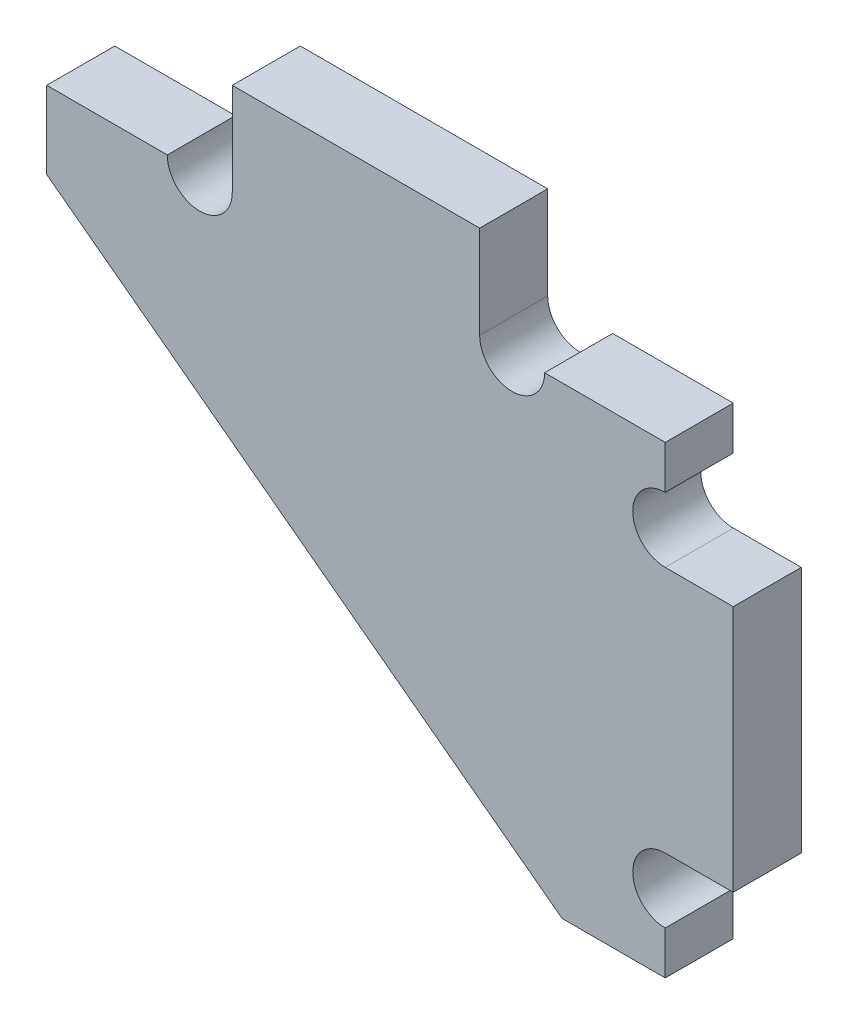
ISO-10303-21;
HEADER;
FILE_DESCRIPTION(('STEP AP214'),'2;1');
FILE_NAME('part.step','',(''),(''),'','','');
FILE_SCHEMA(('AUTOMOTIVE_DESIGN { 1 0 10303 214 1 1 1 1 }'));
ENDSEC;
DATA;
#1=APPLICATION_CONTEXT('core data for automotive mechanical design processes');
#2=APPLICATION_PROTOCOL_DEFINITION('international standard','automotive_design',2000,#1);
#3=PRODUCT_CONTEXT('',#1,'mechanical');
#4=PRODUCT('Part','Part','',(#3));
#5=PRODUCT_RELATED_PRODUCT_CATEGORY('part','',(#4));
#6=PRODUCT_DEFINITION_FORMATION('','',#4);
#7=PRODUCT_DEFINITION_CONTEXT('part definition',#1,'design');
#8=PRODUCT_DEFINITION('design','',#6,#7);
#9=PRODUCT_DEFINITION_SHAPE('','',#8);
#10=(LENGTH_UNIT() NAMED_UNIT(*) SI_UNIT(.MILLI.,.METRE.));
#11=(NAMED_UNIT(*) PLANE_ANGLE_UNIT() SI_UNIT($,.RADIAN.));
#12=(NAMED_UNIT(*) SI_UNIT($,.STERADIAN.) SOLID_ANGLE_UNIT());
#13=UNCERTAINTY_MEASURE_WITH_UNIT(LENGTH_MEASURE(1.E-05),#10,'distance_accuracy_value','');
#14=(GEOMETRIC_REPRESENTATION_CONTEXT(3) GLOBAL_UNCERTAINTY_ASSIGNED_CONTEXT((#13)) GLOBAL_UNIT_ASSIGNED_CONTEXT((#10,
#11,#12)) REPRESENTATION_CONTEXT('',''));
#15=CARTESIAN_POINT('',(0.,0.,0.));
#16=DIRECTION('',(0.,0.,1.));
#17=DIRECTION('',(1.,0.,0.));
#18=AXIS2_PLACEMENT_3D('',#15,#16,#17);
#19=CARTESIAN_POINT('',(5.05,7.5,2.2));
#20=DIRECTION('',(0.,0.,-1.));
#21=DIRECTION('',(-1.,0.,0.));
#22=AXIS2_PLACEMENT_3D('',#19,#20,#21);
#23=CYLINDRICAL_SURFACE('',#22,1.05);
#24=CARTESIAN_POINT('',(5.05,7.5,0.));
#25=DIRECTION('',(0.,0.,1.));
#26=DIRECTION('',(1.,0.,0.));
#27=AXIS2_PLACEMENT_3D('',#24,#25,#26);
#28=CIRCLE('',#27,1.05);
#29=CARTESIAN_POINT('',(4.,7.5,0.));
#30=VERTEX_POINT('',#29);
#31=CARTESIAN_POINT('',(6.1,7.5,0.));
#32=VERTEX_POINT('',#31);
#33=EDGE_CURVE('E184',#30,#32,#28,.T.);
#34=ORIENTED_EDGE('',*,*,#33,.F.);
#35=DIRECTION('',(0.,0.,-1.));
#36=VECTOR('',#35,1.);
#37=CARTESIAN_POINT('',(4.,7.5,2.2));
#38=LINE('',#37,#36);
#39=CARTESIAN_POINT('',(4.,7.5,2.2));
#40=VERTEX_POINT('',#39);
#41=EDGE_CURVE('E11',#40,#30,#38,.T.);
#42=ORIENTED_EDGE('',*,*,#41,.F.);
#43=CARTESIAN_POINT('',(5.05,7.5,2.2));
#44=DIRECTION('',(0.,0.,1.));
#45=DIRECTION('',(1.,0.,0.));
#46=AXIS2_PLACEMENT_3D('',#43,#44,#45);
#47=CIRCLE('',#46,1.05);
#48=CARTESIAN_POINT('',(6.1,7.5,2.2));
#49=VERTEX_POINT('',#48);
#50=EDGE_CURVE('E228',#40,#49,#47,.T.);
#51=ORIENTED_EDGE('',*,*,#50,.T.);
#52=DIRECTION('',(0.,0.,-1.));
#53=VECTOR('',#52,1.);
#54=CARTESIAN_POINT('',(6.1,7.5,2.2));
#55=LINE('',#54,#53);
#56=EDGE_CURVE('E113',#49,#32,#55,.T.);
#57=ORIENTED_EDGE('',*,*,#56,.T.);
#58=EDGE_LOOP('',(#34,#42,#51,#57));
#59=FACE_BOUND('',#58,.T.);
#60=ADVANCED_FACE('F36',(#59),#23,.F.);
#61=CARTESIAN_POINT('',(4.,0.,2.2));
#62=DIRECTION('',(1.,0.,0.));
#63=DIRECTION('',(0.,0.,-1.));
#64=AXIS2_PLACEMENT_3D('',#61,#62,#63);
#65=PLANE('',#64);
#66=DIRECTION('',(0.,-1.,0.));
#67=VECTOR('',#66,1.);
#68=CARTESIAN_POINT('',(4.,0.,0.));
#69=LINE('',#68,#67);
#70=CARTESIAN_POINT('',(4.,10.5,0.));
#71=VERTEX_POINT('',#70);
#72=EDGE_CURVE('E187',#71,#30,#69,.T.);
#73=ORIENTED_EDGE('',*,*,#72,.F.);
#74=DIRECTION('',(0.,0.,-1.));
#75=VECTOR('',#74,1.);
#76=CARTESIAN_POINT('',(4.,10.5,2.2));
#77=LINE('',#76,#75);
#78=CARTESIAN_POINT('',(4.,10.5,2.2));
#79=VERTEX_POINT('',#78);
#80=EDGE_CURVE('E44',#79,#71,#77,.T.);
#81=ORIENTED_EDGE('',*,*,#80,.F.);
#82=DIRECTION('',(0.,-1.,0.));
#83=VECTOR('',#82,1.);
#84=CARTESIAN_POINT('',(4.,0.,2.2));
#85=LINE('',#84,#83);
#86=EDGE_CURVE('E278',#79,#40,#85,.T.);
#87=ORIENTED_EDGE('',*,*,#86,.T.);
#88=ORIENTED_EDGE('',*,*,#41,.T.);
#89=EDGE_LOOP('',(#73,#81,#87,#88));
#90=FACE_BOUND('',#89,.T.);
#91=ADVANCED_FACE('F265',(#90),#65,.T.);
#92=CARTESIAN_POINT('',(0.,10.5,2.2));
#93=DIRECTION('',(0.,1.,0.));
#94=DIRECTION('',(-1.,0.,0.));
#95=AXIS2_PLACEMENT_3D('',#92,#93,#94);
#96=PLANE('',#95);
#97=DIRECTION('',(1.,0.,0.));
#98=VECTOR('',#97,1.);
#99=CARTESIAN_POINT('',(0.,10.5,0.));
#100=LINE('',#99,#98);
#101=CARTESIAN_POINT('',(-4.,10.5,0.));
#102=VERTEX_POINT('',#101);
#103=EDGE_CURVE('E190',#102,#71,#100,.T.);
#104=ORIENTED_EDGE('',*,*,#103,.F.);
#105=DIRECTION('',(0.,0.,-1.));
#106=VECTOR('',#105,1.);
#107=CARTESIAN_POINT('',(-4.,10.5,2.2));
#108=LINE('',#107,#106);
#109=CARTESIAN_POINT('',(-4.,10.5,2.2));
#110=VERTEX_POINT('',#109);
#111=EDGE_CURVE('E254',#110,#102,#108,.T.);
#112=ORIENTED_EDGE('',*,*,#111,.F.);
#113=DIRECTION('',(1.,0.,0.));
#114=VECTOR('',#113,1.);
#115=CARTESIAN_POINT('',(0.,10.5,2.2));
#116=LINE('',#115,#114);
#117=EDGE_CURVE('E261',#110,#79,#116,.T.);
#118=ORIENTED_EDGE('',*,*,#117,.T.);
#119=ORIENTED_EDGE('',*,*,#80,.T.);
#120=EDGE_LOOP('',(#104,#112,#118,#119));
#121=FACE_BOUND('',#120,.T.);
#122=ADVANCED_FACE('F259',(#121),#96,.T.);
#123=CARTESIAN_POINT('',(-3.99999999999998,0.,2.2));
#124=DIRECTION('',(-1.,0.,0.));
#125=DIRECTION('',(0.,-1.,0.));
#126=AXIS2_PLACEMENT_3D('',#123,#124,#125);
#127=PLANE('',#126);
#128=DIRECTION('',(0.,1.,0.));
#129=VECTOR('',#128,1.);
#130=CARTESIAN_POINT('',(-3.99999999999998,0.,0.));
#131=LINE('',#130,#129);
#132=CARTESIAN_POINT('',(-4.,7.49999999999999,0.));
#133=VERTEX_POINT('',#132);
#134=EDGE_CURVE('E193',#133,#102,#131,.T.);
#135=ORIENTED_EDGE('',*,*,#134,.F.);
#136=DIRECTION('',(0.,0.,-1.));
#137=VECTOR('',#136,1.);
#138=CARTESIAN_POINT('',(-4.,7.49999999999999,2.2));
#139=LINE('',#138,#137);
#140=CARTESIAN_POINT('',(-4.,7.49999999999999,2.2));
#141=VERTEX_POINT('',#140);
#142=EDGE_CURVE('E252',#141,#133,#139,.T.);
#143=ORIENTED_EDGE('',*,*,#142,.F.);
#144=DIRECTION('',(0.,1.,0.));
#145=VECTOR('',#144,1.);
#146=CARTESIAN_POINT('',(-3.99999999999998,0.,2.2));
#147=LINE('',#146,#145);
#148=EDGE_CURVE('E275',#141,#110,#147,.T.);
#149=ORIENTED_EDGE('',*,*,#148,.T.);
#150=ORIENTED_EDGE('',*,*,#111,.T.);
#151=EDGE_LOOP('',(#135,#143,#149,#150));
#152=FACE_BOUND('',#151,.T.);
#153=ADVANCED_FACE('F272',(#152),#127,.T.);
#154=CARTESIAN_POINT('',(-5.05,7.49999999999999,2.2));
#155=DIRECTION('',(0.,0.,-1.));
#156=DIRECTION('',(-1.,0.,0.));
#157=AXIS2_PLACEMENT_3D('',#154,#155,#156);
#158=CYLINDRICAL_SURFACE('',#157,1.05);
#159=CARTESIAN_POINT('',(-5.05,7.49999999999999,0.));
#160=DIRECTION('',(0.,0.,1.));
#161=DIRECTION('',(1.,0.,0.));
#162=AXIS2_PLACEMENT_3D('',#159,#160,#161);
#163=CIRCLE('',#162,1.05);
#164=CARTESIAN_POINT('',(-6.1,7.5,0.));
#165=VERTEX_POINT('',#164);
#166=EDGE_CURVE('E196',#165,#133,#163,.T.);
#167=ORIENTED_EDGE('',*,*,#166,.F.);
#168=DIRECTION('',(0.,0.,-1.));
#169=VECTOR('',#168,1.);
#170=CARTESIAN_POINT('',(-6.1,7.5,2.2));
#171=LINE('',#170,#169);
#172=CARTESIAN_POINT('',(-6.1,7.5,2.2));
#173=VERTEX_POINT('',#172);
#174=EDGE_CURVE('E250',#173,#165,#171,.T.);
#175=ORIENTED_EDGE('',*,*,#174,.F.);
#176=CARTESIAN_POINT('',(-5.05,7.49999999999999,2.2));
#177=DIRECTION('',(0.,0.,1.));
#178=DIRECTION('',(1.,0.,0.));
#179=AXIS2_PLACEMENT_3D('',#176,#177,#178);
#180=CIRCLE('',#179,1.05);
#181=EDGE_CURVE('E280',#173,#141,#180,.T.);
#182=ORIENTED_EDGE('',*,*,#181,.T.);
#183=ORIENTED_EDGE('',*,*,#142,.T.);
#184=EDGE_LOOP('',(#167,#175,#182,#183));
#185=FACE_BOUND('',#184,.T.);
#186=ADVANCED_FACE('F326',(#185),#158,.F.);
#187=CARTESIAN_POINT('',(0.,7.49999999999999,2.2));
#188=DIRECTION('',(0.,-1.,0.));
#189=DIRECTION('',(1.,0.,0.));
#190=AXIS2_PLACEMENT_3D('',#187,#188,#189);
#191=PLANE('',#190);
#192=DIRECTION('',(-1.,0.,0.));
#193=VECTOR('',#192,1.);
#194=CARTESIAN_POINT('',(0.,7.49999999999999,0.));
#195=LINE('',#194,#193);
#196=CARTESIAN_POINT('',(-10.,7.5,0.));
#197=VERTEX_POINT('',#196);
#198=EDGE_CURVE('E199',#165,#197,#195,.T.);
#199=ORIENTED_EDGE('',*,*,#198,.T.);
#200=DIRECTION('',(0.,0.,-1.));
#201=VECTOR('',#200,1.);
#202=CARTESIAN_POINT('',(-10.,7.5,2.2));
#203=LINE('',#202,#201);
#204=CARTESIAN_POINT('',(-10.,7.5,2.2));
#205=VERTEX_POINT('',#204);
#206=EDGE_CURVE('E248',#205,#197,#203,.T.);
#207=ORIENTED_EDGE('',*,*,#206,.F.);
#208=DIRECTION('',(-1.,0.,0.));
#209=VECTOR('',#208,1.);
#210=CARTESIAN_POINT('',(0.,7.49999999999999,2.2));
#211=LINE('',#210,#209);
#212=EDGE_CURVE('E286',#173,#205,#211,.T.);
#213=ORIENTED_EDGE('',*,*,#212,.F.);
#214=ORIENTED_EDGE('',*,*,#174,.T.);
#215=EDGE_LOOP('',(#199,#207,#213,#214));
#216=FACE_BOUND('',#215,.T.);
#217=ADVANCED_FACE('F329',(#216),#191,.F.);
#218=CARTESIAN_POINT('',(-10.,0.,2.2));
#219=DIRECTION('',(-1.,0.,0.));
#220=DIRECTION('',(0.,0.,1.));
#221=AXIS2_PLACEMENT_3D('',#218,#219,#220);
#222=PLANE('',#221);
#223=DIRECTION('',(0.,1.,0.));
#224=VECTOR('',#223,1.);
#225=CARTESIAN_POINT('',(-10.,0.,0.));
#226=LINE('',#225,#224);
#227=CARTESIAN_POINT('',(-10.,4.99999999999999,0.));
#228=VERTEX_POINT('',#227);
#229=EDGE_CURVE('E202',#228,#197,#226,.T.);
#230=ORIENTED_EDGE('',*,*,#229,.F.);
#231=DIRECTION('',(0.,0.,-1.));
#232=VECTOR('',#231,1.);
#233=CARTESIAN_POINT('',(-10.,4.99999999999999,2.2));
#234=LINE('',#233,#232);
#235=CARTESIAN_POINT('',(-10.,4.99999999999999,2.2));
#236=VERTEX_POINT('',#235);
#237=EDGE_CURVE('E246',#236,#228,#234,.T.);
#238=ORIENTED_EDGE('',*,*,#237,.F.);
#239=DIRECTION('',(0.,1.,0.));
#240=VECTOR('',#239,1.);
#241=CARTESIAN_POINT('',(-10.,0.,2.2));
#242=LINE('',#241,#240);
#243=EDGE_CURVE('E288',#236,#205,#242,.T.);
#244=ORIENTED_EDGE('',*,*,#243,.T.);
#245=ORIENTED_EDGE('',*,*,#206,.T.);
#246=EDGE_LOOP('',(#230,#238,#244,#245));
#247=FACE_BOUND('',#246,.T.);
#248=ADVANCED_FACE('F333',(#247),#222,.T.);
#249=CARTESIAN_POINT('',(-1.2,-1.6,2.2));
#250=DIRECTION('',(0.6,0.8,0.));
#251=DIRECTION('',(-0.8,0.6,0.));
#252=AXIS2_PLACEMENT_3D('',#249,#250,#251);
#253=PLANE('',#252);
#254=DIRECTION('',(0.8,-0.6,0.));
#255=VECTOR('',#254,1.);
#256=CARTESIAN_POINT('',(-1.2,-1.6,0.));
#257=LINE('',#256,#255);
#258=CARTESIAN_POINT('',(6.66666666666666,-7.5,0.));
#259=VERTEX_POINT('',#258);
#260=EDGE_CURVE('E205',#228,#259,#257,.T.);
#261=ORIENTED_EDGE('',*,*,#260,.T.);
#262=DIRECTION('',(0.,0.,-1.));
#263=VECTOR('',#262,1.);
#264=CARTESIAN_POINT('',(6.66666666666666,-7.5,2.2));
#265=LINE('',#264,#263);
#266=CARTESIAN_POINT('',(6.66666666666666,-7.5,2.2));
#267=VERTEX_POINT('',#266);
#268=EDGE_CURVE('E243',#267,#259,#265,.T.);
#269=ORIENTED_EDGE('',*,*,#268,.F.);
#270=DIRECTION('',(0.8,-0.6,0.));
#271=VECTOR('',#270,1.);
#272=CARTESIAN_POINT('',(-1.2,-1.6,2.2));
#273=LINE('',#272,#271);
#274=EDGE_CURVE('E291',#236,#267,#273,.T.);
#275=ORIENTED_EDGE('',*,*,#274,.F.);
#276=ORIENTED_EDGE('',*,*,#237,.T.);
#277=EDGE_LOOP('',(#261,#269,#275,#276));
#278=FACE_BOUND('',#277,.T.);
#279=ADVANCED_FACE('F337',(#278),#253,.F.);
#280=CARTESIAN_POINT('',(0.,-7.5,2.2));
#281=DIRECTION('',(0.,1.,0.));
#282=DIRECTION('',(-1.,0.,0.));
#283=AXIS2_PLACEMENT_3D('',#280,#281,#282);
#284=PLANE('',#283);
#285=DIRECTION('',(1.,0.,0.));
#286=VECTOR('',#285,1.);
#287=CARTESIAN_POINT('',(0.,-7.5,0.));
#288=LINE('',#287,#286);
#289=CARTESIAN_POINT('',(10.,-7.5,0.));
#290=VERTEX_POINT('',#289);
#291=EDGE_CURVE('E207',#259,#290,#288,.T.);
#292=ORIENTED_EDGE('',*,*,#291,.T.);
#293=DIRECTION('',(0.,0.,-1.));
#294=VECTOR('',#293,1.);
#295=CARTESIAN_POINT('',(10.,-7.5,2.2));
#296=LINE('',#295,#294);
#297=CARTESIAN_POINT('',(10.,-7.5,2.2));
#298=VERTEX_POINT('',#297);
#299=EDGE_CURVE('E240',#298,#290,#296,.T.);
#300=ORIENTED_EDGE('',*,*,#299,.F.);
#301=DIRECTION('',(1.,0.,0.));
#302=VECTOR('',#301,1.);
#303=CARTESIAN_POINT('',(0.,-7.5,2.2));
#304=LINE('',#303,#302);
#305=EDGE_CURVE('E293',#267,#298,#304,.T.);
#306=ORIENTED_EDGE('',*,*,#305,.F.);
#307=ORIENTED_EDGE('',*,*,#268,.T.);
#308=EDGE_LOOP('',(#292,#300,#306,#307));
#309=FACE_BOUND('',#308,.T.);
#310=ADVANCED_FACE('F341',(#309),#284,.F.);
#311=CARTESIAN_POINT('',(10.,0.,2.2));
#312=DIRECTION('',(-1.,0.,0.));
#313=DIRECTION('',(0.,-1.,0.));
#314=AXIS2_PLACEMENT_3D('',#311,#312,#313);
#315=PLANE('',#314);
#316=DIRECTION('',(0.,1.,0.));
#317=VECTOR('',#316,1.);
#318=CARTESIAN_POINT('',(10.,0.,0.));
#319=LINE('',#318,#317);
#320=CARTESIAN_POINT('',(10.,-6.1,0.));
#321=VERTEX_POINT('',#320);
#322=EDGE_CURVE('E209',#290,#321,#319,.T.);
#323=ORIENTED_EDGE('',*,*,#322,.T.);
#324=DIRECTION('',(0.,0.,-1.));
#325=VECTOR('',#324,1.);
#326=CARTESIAN_POINT('',(10.,-6.1,2.2));
#327=LINE('',#326,#325);
#328=CARTESIAN_POINT('',(10.,-6.1,2.2));
#329=VERTEX_POINT('',#328);
#330=EDGE_CURVE('E238',#329,#321,#327,.T.);
#331=ORIENTED_EDGE('',*,*,#330,.F.);
#332=DIRECTION('',(0.,1.,0.));
#333=VECTOR('',#332,1.);
#334=CARTESIAN_POINT('',(10.,0.,2.2));
#335=LINE('',#334,#333);
#336=EDGE_CURVE('E295',#298,#329,#335,.T.);
#337=ORIENTED_EDGE('',*,*,#336,.F.);
#338=ORIENTED_EDGE('',*,*,#299,.T.);
#339=EDGE_LOOP('',(#323,#331,#337,#338));
#340=FACE_BOUND('',#339,.T.);
#341=ADVANCED_FACE('F345',(#340),#315,.F.);
#342=CARTESIAN_POINT('',(10.,-5.05,2.2));
#343=DIRECTION('',(0.,0.,-1.));
#344=DIRECTION('',(-1.,0.,0.));
#345=AXIS2_PLACEMENT_3D('',#342,#343,#344);
#346=CYLINDRICAL_SURFACE('',#345,1.05);
#347=CARTESIAN_POINT('',(10.,-5.05,0.));
#348=DIRECTION('',(0.,0.,1.));
#349=DIRECTION('',(1.,0.,0.));
#350=AXIS2_PLACEMENT_3D('',#347,#348,#349);
#351=CIRCLE('',#350,1.05);
#352=CARTESIAN_POINT('',(10.,-4.,0.));
#353=VERTEX_POINT('',#352);
#354=EDGE_CURVE('E212',#353,#321,#351,.T.);
#355=ORIENTED_EDGE('',*,*,#354,.F.);
#356=DIRECTION('',(0.,0.,-1.));
#357=VECTOR('',#356,1.);
#358=CARTESIAN_POINT('',(10.,-4.,2.2));
#359=LINE('',#358,#357);
#360=CARTESIAN_POINT('',(10.,-4.,2.2));
#361=VERTEX_POINT('',#360);
#362=EDGE_CURVE('E236',#361,#353,#359,.T.);
#363=ORIENTED_EDGE('',*,*,#362,.F.);
#364=CARTESIAN_POINT('',(10.,-5.05,2.2));
#365=DIRECTION('',(0.,0.,1.));
#366=DIRECTION('',(1.,0.,0.));
#367=AXIS2_PLACEMENT_3D('',#364,#365,#366);
#368=CIRCLE('',#367,1.05);
#369=EDGE_CURVE('E297',#361,#329,#368,.T.);
#370=ORIENTED_EDGE('',*,*,#369,.T.);
#371=ORIENTED_EDGE('',*,*,#330,.T.);
#372=EDGE_LOOP('',(#355,#363,#370,#371));
#373=FACE_BOUND('',#372,.T.);
#374=ADVANCED_FACE('F349',(#373),#346,.F.);
#375=CARTESIAN_POINT('',(0.,-4.,2.2));
#376=DIRECTION('',(0.,-1.,0.));
#377=DIRECTION('',(0.,0.,-1.));
#378=AXIS2_PLACEMENT_3D('',#375,#376,#377);
#379=PLANE('',#378);
#380=DIRECTION('',(-1.,0.,0.));
#381=VECTOR('',#380,1.);
#382=CARTESIAN_POINT('',(0.,-4.,0.));
#383=LINE('',#382,#381);
#384=CARTESIAN_POINT('',(12.2,-4.,0.));
#385=VERTEX_POINT('',#384);
#386=EDGE_CURVE('E215',#385,#353,#383,.T.);
#387=ORIENTED_EDGE('',*,*,#386,.F.);
#388=DIRECTION('',(0.,0.,-1.));
#389=VECTOR('',#388,1.);
#390=CARTESIAN_POINT('',(12.2,-4.,2.2));
#391=LINE('',#390,#389);
#392=CARTESIAN_POINT('',(12.2,-4.,2.2));
#393=VERTEX_POINT('',#392);
#394=EDGE_CURVE('E234',#393,#385,#391,.T.);
#395=ORIENTED_EDGE('',*,*,#394,.F.);
#396=DIRECTION('',(-1.,0.,0.));
#397=VECTOR('',#396,1.);
#398=CARTESIAN_POINT('',(0.,-4.,2.2));
#399=LINE('',#398,#397);
#400=EDGE_CURVE('E300',#393,#361,#399,.T.);
#401=ORIENTED_EDGE('',*,*,#400,.T.);
#402=ORIENTED_EDGE('',*,*,#362,.T.);
#403=EDGE_LOOP('',(#387,#395,#401,#402));
#404=FACE_BOUND('',#403,.T.);
#405=ADVANCED_FACE('F353',(#404),#379,.T.);
#406=CARTESIAN_POINT('',(12.2,0.,2.2));
#407=DIRECTION('',(1.,0.,0.));
#408=DIRECTION('',(0.,1.,0.));
#409=AXIS2_PLACEMENT_3D('',#406,#407,#408);
#410=PLANE('',#409);
#411=DIRECTION('',(0.,-1.,0.));
#412=VECTOR('',#411,1.);
#413=CARTESIAN_POINT('',(12.2,0.,0.));
#414=LINE('',#413,#412);
#415=CARTESIAN_POINT('',(12.2,4.,0.));
#416=VERTEX_POINT('',#415);
#417=EDGE_CURVE('E218',#416,#385,#414,.T.);
#418=ORIENTED_EDGE('',*,*,#417,.F.);
#419=DIRECTION('',(0.,0.,-1.));
#420=VECTOR('',#419,1.);
#421=CARTESIAN_POINT('',(12.2,4.,2.2));
#422=LINE('',#421,#420);
#423=CARTESIAN_POINT('',(12.2,4.,2.2));
#424=VERTEX_POINT('',#423);
#425=EDGE_CURVE('E232',#424,#416,#422,.T.);
#426=ORIENTED_EDGE('',*,*,#425,.F.);
#427=DIRECTION('',(0.,-1.,0.));
#428=VECTOR('',#427,1.);
#429=CARTESIAN_POINT('',(12.2,0.,2.2));
#430=LINE('',#429,#428);
#431=EDGE_CURVE('E179',#424,#393,#430,.T.);
#432=ORIENTED_EDGE('',*,*,#431,.T.);
#433=ORIENTED_EDGE('',*,*,#394,.T.);
#434=EDGE_LOOP('',(#418,#426,#432,#433));
#435=FACE_BOUND('',#434,.T.);
#436=ADVANCED_FACE('F305',(#435),#410,.T.);
#437=CARTESIAN_POINT('',(0.,4.,2.2));
#438=DIRECTION('',(0.,1.,0.));
#439=DIRECTION('',(0.,0.,1.));
#440=AXIS2_PLACEMENT_3D('',#437,#438,#439);
#441=PLANE('',#440);
#442=DIRECTION('',(1.,0.,0.));
#443=VECTOR('',#442,1.);
#444=CARTESIAN_POINT('',(0.,4.,0.));
#445=LINE('',#444,#443);
#446=CARTESIAN_POINT('',(10.,4.,0.));
#447=VERTEX_POINT('',#446);
#448=EDGE_CURVE('E221',#447,#416,#445,.T.);
#449=ORIENTED_EDGE('',*,*,#448,.F.);
#450=DIRECTION('',(0.,0.,-1.));
#451=VECTOR('',#450,1.);
#452=CARTESIAN_POINT('',(10.,4.,2.2));
#453=LINE('',#452,#451);
#454=CARTESIAN_POINT('',(10.,4.,2.2));
#455=VERTEX_POINT('',#454);
#456=EDGE_CURVE('E167',#455,#447,#453,.T.);
#457=ORIENTED_EDGE('',*,*,#456,.F.);
#458=DIRECTION('',(1.,0.,0.));
#459=VECTOR('',#458,1.);
#460=CARTESIAN_POINT('',(0.,4.,2.2));
#461=LINE('',#460,#459);
#462=EDGE_CURVE('E177',#455,#424,#461,.T.);
#463=ORIENTED_EDGE('',*,*,#462,.T.);
#464=ORIENTED_EDGE('',*,*,#425,.T.);
#465=EDGE_LOOP('',(#449,#457,#463,#464));
#466=FACE_BOUND('',#465,.T.);
#467=ADVANCED_FACE('F311',(#466),#441,.T.);
#468=CARTESIAN_POINT('',(10.,5.05,2.2));
#469=DIRECTION('',(0.,0.,-1.));
#470=DIRECTION('',(-1.,0.,0.));
#471=AXIS2_PLACEMENT_3D('',#468,#469,#470);
#472=CYLINDRICAL_SURFACE('',#471,1.05);
#473=CARTESIAN_POINT('',(10.,5.05,0.));
#474=DIRECTION('',(0.,0.,1.));
#475=DIRECTION('',(1.,0.,0.));
#476=AXIS2_PLACEMENT_3D('',#473,#474,#475);
#477=CIRCLE('',#476,1.05);
#478=CARTESIAN_POINT('',(10.,6.1,0.));
#479=VERTEX_POINT('',#478);
#480=EDGE_CURVE('E166',#479,#447,#477,.T.);
#481=ORIENTED_EDGE('',*,*,#480,.F.);
#482=DIRECTION('',(0.,0.,-1.));
#483=VECTOR('',#482,1.);
#484=CARTESIAN_POINT('',(10.,6.1,2.2));
#485=LINE('',#484,#483);
#486=CARTESIAN_POINT('',(10.,6.1,2.2));
#487=VERTEX_POINT('',#486);
#488=EDGE_CURVE('E160',#487,#479,#485,.T.);
#489=ORIENTED_EDGE('',*,*,#488,.F.);
#490=CARTESIAN_POINT('',(10.,5.05,2.2));
#491=DIRECTION('',(0.,0.,1.));
#492=DIRECTION('',(1.,0.,0.));
#493=AXIS2_PLACEMENT_3D('',#490,#491,#492);
#494=CIRCLE('',#493,1.05);
#495=EDGE_CURVE('E164',#487,#455,#494,.T.);
#496=ORIENTED_EDGE('',*,*,#495,.T.);
#497=ORIENTED_EDGE('',*,*,#456,.T.);
#498=EDGE_LOOP('',(#481,#489,#496,#497));
#499=FACE_BOUND('',#498,.T.);
#500=ADVANCED_FACE('F162',(#499),#472,.F.);
#501=CARTESIAN_POINT('',(10.,0.,2.2));
#502=DIRECTION('',(-1.,0.,0.));
#503=DIRECTION('',(0.,-1.,0.));
#504=AXIS2_PLACEMENT_3D('',#501,#502,#503);
#505=PLANE('',#504);
#506=DIRECTION('',(0.,1.,0.));
#507=VECTOR('',#506,1.);
#508=CARTESIAN_POINT('',(10.,0.,0.));
#509=LINE('',#508,#507);
#510=CARTESIAN_POINT('',(10.,7.5,0.));
#511=VERTEX_POINT('',#510);
#512=EDGE_CURVE('E106',#479,#511,#509,.T.);
#513=ORIENTED_EDGE('',*,*,#512,.T.);
#514=DIRECTION('',(0.,0.,-1.));
#515=VECTOR('',#514,1.);
#516=CARTESIAN_POINT('',(10.,7.5,2.2));
#517=LINE('',#516,#515);
#518=CARTESIAN_POINT('',(10.,7.5,2.2));
#519=VERTEX_POINT('',#518);
#520=EDGE_CURVE('E168',#519,#511,#517,.T.);
#521=ORIENTED_EDGE('',*,*,#520,.F.);
#522=DIRECTION('',(0.,1.,0.));
#523=VECTOR('',#522,1.);
#524=CARTESIAN_POINT('',(10.,0.,2.2));
#525=LINE('',#524,#523);
#526=EDGE_CURVE('E170',#487,#519,#525,.T.);
#527=ORIENTED_EDGE('',*,*,#526,.F.);
#528=ORIENTED_EDGE('',*,*,#488,.T.);
#529=EDGE_LOOP('',(#513,#521,#527,#528));
#530=FACE_BOUND('',#529,.T.);
#531=ADVANCED_FACE('F171',(#530),#505,.F.);
#532=CARTESIAN_POINT('',(0.,7.49999999999999,2.2));
#533=DIRECTION('',(0.,-1.,0.));
#534=DIRECTION('',(1.,0.,0.));
#535=AXIS2_PLACEMENT_3D('',#532,#533,#534);
#536=PLANE('',#535);
#537=DIRECTION('',(-1.,0.,0.));
#538=VECTOR('',#537,1.);
#539=CARTESIAN_POINT('',(0.,7.49999999999999,0.));
#540=LINE('',#539,#538);
#541=EDGE_CURVE('E226',#511,#32,#540,.T.);
#542=ORIENTED_EDGE('',*,*,#541,.T.);
#543=ORIENTED_EDGE('',*,*,#56,.F.);
#544=DIRECTION('',(-1.,0.,0.));
#545=VECTOR('',#544,1.);
#546=CARTESIAN_POINT('',(0.,7.49999999999999,2.2));
#547=LINE('',#546,#545);
#548=EDGE_CURVE('E52',#519,#49,#547,.T.);
#549=ORIENTED_EDGE('',*,*,#548,.F.);
#550=ORIENTED_EDGE('',*,*,#520,.T.);
#551=EDGE_LOOP('',(#542,#543,#549,#550));
#552=FACE_BOUND('',#551,.T.);
#553=ADVANCED_FACE('F314',(#552),#536,.F.);
#554=CARTESIAN_POINT('',(0.,0.,2.2));
#555=DIRECTION('',(0.,0.,1.));
#556=DIRECTION('',(1.,0.,0.));
#557=AXIS2_PLACEMENT_3D('',#554,#555,#556);
#558=PLANE('',#557);
#559=ORIENTED_EDGE('',*,*,#50,.F.);
#560=ORIENTED_EDGE('',*,*,#86,.F.);
#561=ORIENTED_EDGE('',*,*,#117,.F.);
#562=ORIENTED_EDGE('',*,*,#148,.F.);
#563=ORIENTED_EDGE('',*,*,#181,.F.);
#564=ORIENTED_EDGE('',*,*,#212,.T.);
#565=ORIENTED_EDGE('',*,*,#243,.F.);
#566=ORIENTED_EDGE('',*,*,#274,.T.);
#567=ORIENTED_EDGE('',*,*,#305,.T.);
#568=ORIENTED_EDGE('',*,*,#336,.T.);
#569=ORIENTED_EDGE('',*,*,#369,.F.);
#570=ORIENTED_EDGE('',*,*,#400,.F.);
#571=ORIENTED_EDGE('',*,*,#431,.F.);
#572=ORIENTED_EDGE('',*,*,#462,.F.);
#573=ORIENTED_EDGE('',*,*,#495,.F.);
#574=ORIENTED_EDGE('',*,*,#526,.T.);
#575=ORIENTED_EDGE('',*,*,#548,.T.);
#576=EDGE_LOOP('',(#559,#560,#561,#562,#563,#564,#565,#566,#567,#568,#569,#570,#571,#572,#573,
#574,#575));
#577=FACE_BOUND('',#576,.T.);
#578=ADVANCED_FACE('F174',(#577),#558,.T.);
#579=CARTESIAN_POINT('',(0.,0.,0.));
#580=DIRECTION('',(0.,0.,1.));
#581=DIRECTION('',(1.,0.,0.));
#582=AXIS2_PLACEMENT_3D('',#579,#580,#581);
#583=PLANE('',#582);
#584=ORIENTED_EDGE('',*,*,#33,.T.);
#585=ORIENTED_EDGE('',*,*,#541,.F.);
#586=ORIENTED_EDGE('',*,*,#512,.F.);
#587=ORIENTED_EDGE('',*,*,#480,.T.);
#588=ORIENTED_EDGE('',*,*,#448,.T.);
#589=ORIENTED_EDGE('',*,*,#417,.T.);
#590=ORIENTED_EDGE('',*,*,#386,.T.);
#591=ORIENTED_EDGE('',*,*,#354,.T.);
#592=ORIENTED_EDGE('',*,*,#322,.F.);
#593=ORIENTED_EDGE('',*,*,#291,.F.);
#594=ORIENTED_EDGE('',*,*,#260,.F.);
#595=ORIENTED_EDGE('',*,*,#229,.T.);
#596=ORIENTED_EDGE('',*,*,#198,.F.);
#597=ORIENTED_EDGE('',*,*,#166,.T.);
#598=ORIENTED_EDGE('',*,*,#134,.T.);
#599=ORIENTED_EDGE('',*,*,#103,.T.);
#600=ORIENTED_EDGE('',*,*,#72,.T.);
#601=EDGE_LOOP('',(#584,#585,#586,#587,#588,#589,#590,#591,#592,#593,#594,#595,#596,#597,#598,
#599,#600));
#602=FACE_BOUND('',#601,.T.);
#603=ADVANCED_FACE('F267',(#602),#583,.F.);
#604=CLOSED_SHELL('',(#60,#91,#122,#153,#186,#217,#248,#279,#310,#341,#374,#405,#436,#467,#500,
#531,#553,#578,#603));
#605=MANIFOLD_SOLID_BREP('B2',#604);
#606=ADVANCED_BREP_SHAPE_REPRESENTATION('',(#18,#605),#14);
#607=SHAPE_DEFINITION_REPRESENTATION(#9,#606);
ENDSEC;
END-ISO-10303-21;
